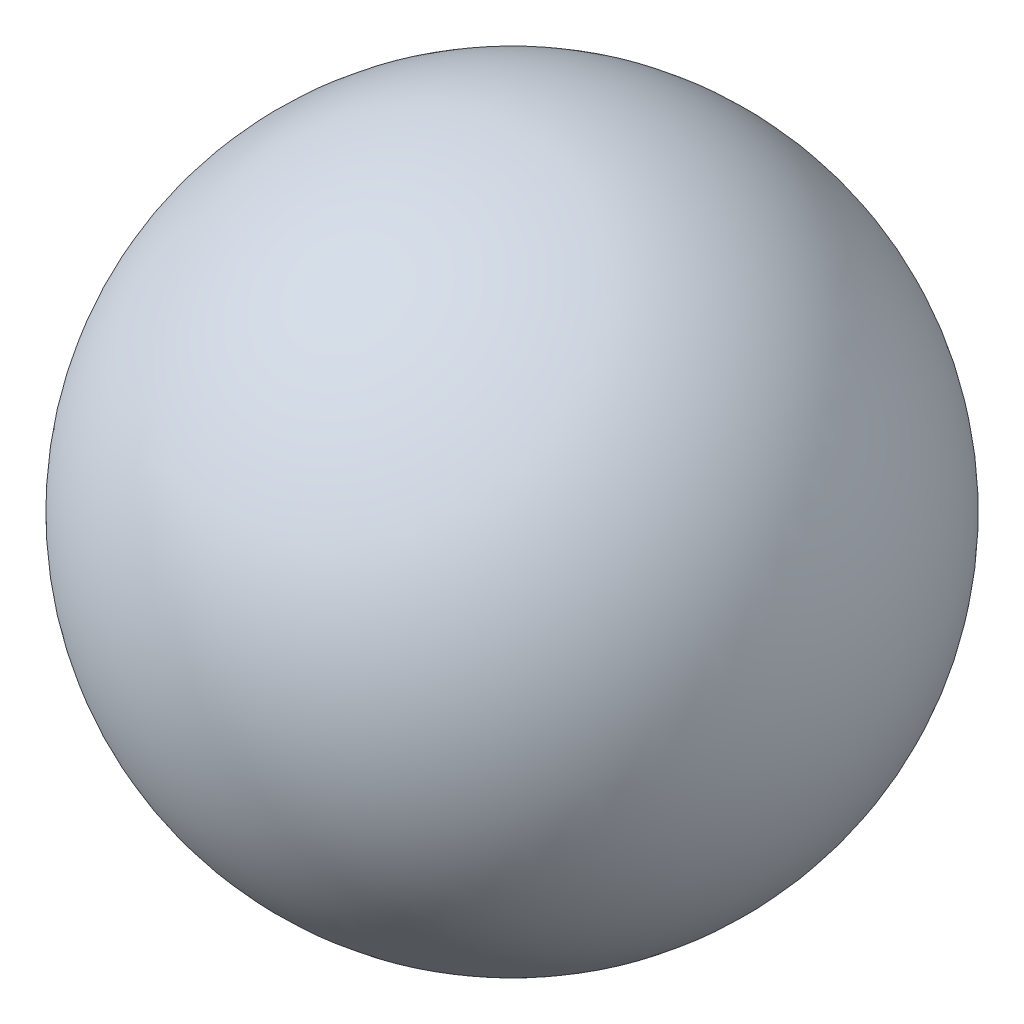
ISO-10303-21;
HEADER;
FILE_DESCRIPTION(('STEP AP214'),'2;1');
FILE_NAME('part.step','',(''),(''),'','','');
FILE_SCHEMA(('AUTOMOTIVE_DESIGN { 1 0 10303 214 1 1 1 1 }'));
ENDSEC;
DATA;
#1=APPLICATION_CONTEXT('core data for automotive mechanical design processes');
#2=APPLICATION_PROTOCOL_DEFINITION('international standard','automotive_design',2000,#1);
#3=PRODUCT_CONTEXT('',#1,'mechanical');
#4=PRODUCT('Part','Part','',(#3));
#5=PRODUCT_RELATED_PRODUCT_CATEGORY('part','',(#4));
#6=PRODUCT_DEFINITION_FORMATION('','',#4);
#7=PRODUCT_DEFINITION_CONTEXT('part definition',#1,'design');
#8=PRODUCT_DEFINITION('design','',#6,#7);
#9=PRODUCT_DEFINITION_SHAPE('','',#8);
#10=(LENGTH_UNIT() NAMED_UNIT(*) SI_UNIT(.MILLI.,.METRE.));
#11=(NAMED_UNIT(*) PLANE_ANGLE_UNIT() SI_UNIT($,.RADIAN.));
#12=(NAMED_UNIT(*) SI_UNIT($,.STERADIAN.) SOLID_ANGLE_UNIT());
#13=UNCERTAINTY_MEASURE_WITH_UNIT(LENGTH_MEASURE(1.E-05),#10,'distance_accuracy_value','');
#14=(GEOMETRIC_REPRESENTATION_CONTEXT(3) GLOBAL_UNCERTAINTY_ASSIGNED_CONTEXT((#13)) GLOBAL_UNIT_ASSIGNED_CONTEXT((#10,
#11,#12)) REPRESENTATION_CONTEXT('',''));
#15=CARTESIAN_POINT('',(0.,0.,0.));
#16=DIRECTION('',(0.,0.,1.));
#17=DIRECTION('',(1.,0.,0.));
#18=AXIS2_PLACEMENT_3D('',#15,#16,#17);
#19=CARTESIAN_POINT('',(0.,1.85136067370694,0.));
#20=DIRECTION('',(0.,1.,0.));
#21=DIRECTION('',(-1.,0.,0.));
#22=AXIS2_PLACEMENT_3D('',#19,#20,#21);
#23=SPHERICAL_SURFACE('',#22,8.);
#24=CARTESIAN_POINT('',(0.,9.85136067370694,0.));
#25=VERTEX_POINT('',#24);
#26=VERTEX_LOOP('',#25);
#27=FACE_BOUND('',#26,.T.);
#28=ADVANCED_FACE('F41',(#27),#23,.T.);
#29=CLOSED_SHELL('',(#28));
#30=MANIFOLD_SOLID_BREP('B2',#29);
#31=ADVANCED_BREP_SHAPE_REPRESENTATION('',(#18,#30),#14);
#32=SHAPE_DEFINITION_REPRESENTATION(#9,#31);
ENDSEC;
END-ISO-10303-21;
